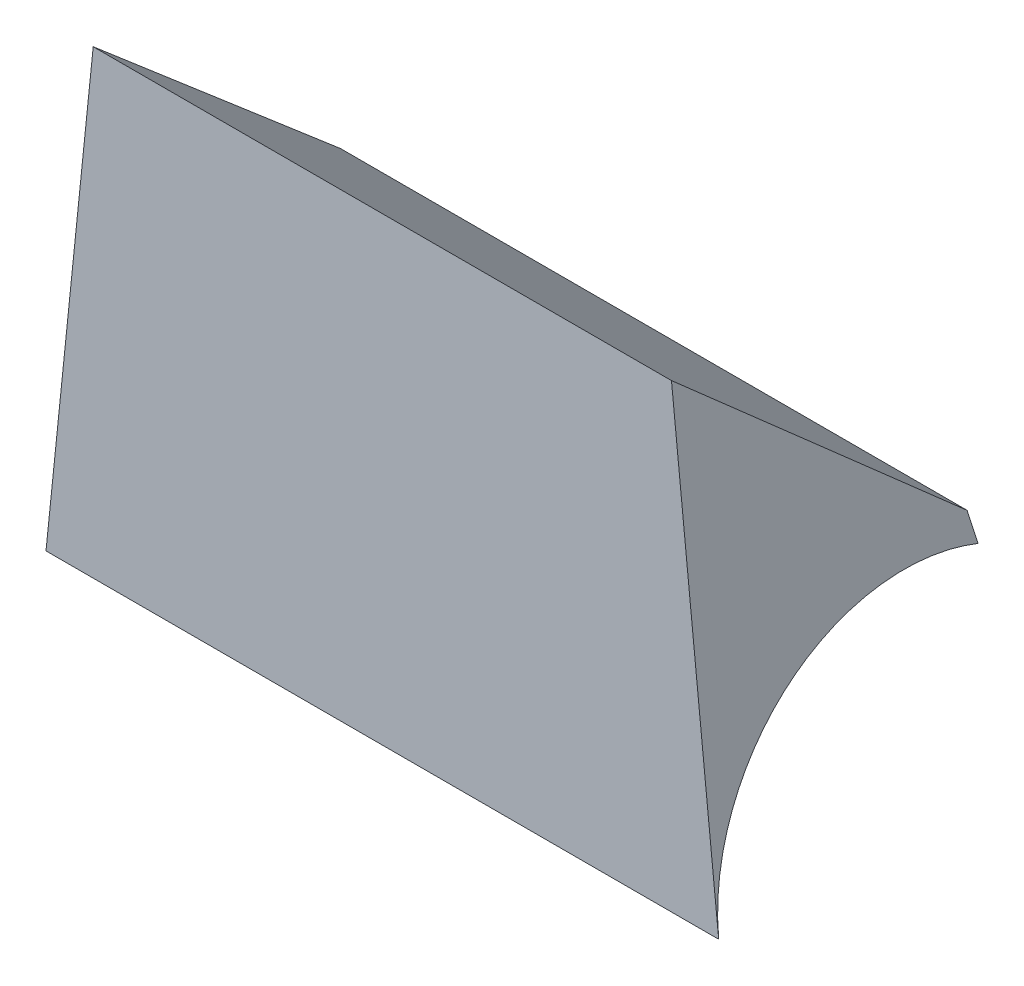
ISO-10303-21;
HEADER;
FILE_DESCRIPTION(('STEP AP214'),'2;1');
FILE_NAME('part.step','',(''),(''),'','','');
FILE_SCHEMA(('AUTOMOTIVE_DESIGN { 1 0 10303 214 1 1 1 1 }'));
ENDSEC;
DATA;
#1=APPLICATION_CONTEXT('core data for automotive mechanical design processes');
#2=APPLICATION_PROTOCOL_DEFINITION('international standard','automotive_design',2000,#1);
#3=PRODUCT_CONTEXT('',#1,'mechanical');
#4=PRODUCT('Part','Part','',(#3));
#5=PRODUCT_RELATED_PRODUCT_CATEGORY('part','',(#4));
#6=PRODUCT_DEFINITION_FORMATION('','',#4);
#7=PRODUCT_DEFINITION_CONTEXT('part definition',#1,'design');
#8=PRODUCT_DEFINITION('design','',#6,#7);
#9=PRODUCT_DEFINITION_SHAPE('','',#8);
#10=(LENGTH_UNIT() NAMED_UNIT(*) SI_UNIT(.MILLI.,.METRE.));
#11=(NAMED_UNIT(*) PLANE_ANGLE_UNIT() SI_UNIT($,.RADIAN.));
#12=(NAMED_UNIT(*) SI_UNIT($,.STERADIAN.) SOLID_ANGLE_UNIT());
#13=UNCERTAINTY_MEASURE_WITH_UNIT(LENGTH_MEASURE(1.E-05),#10,'distance_accuracy_value','');
#14=(GEOMETRIC_REPRESENTATION_CONTEXT(3) GLOBAL_UNCERTAINTY_ASSIGNED_CONTEXT((#13)) GLOBAL_UNIT_ASSIGNED_CONTEXT((#10,
#11,#12)) REPRESENTATION_CONTEXT('',''));
#15=CARTESIAN_POINT('',(0.,0.,0.));
#16=DIRECTION('',(0.,0.,1.));
#17=DIRECTION('',(1.,0.,0.));
#18=AXIS2_PLACEMENT_3D('',#15,#16,#17);
#19=CARTESIAN_POINT('',(57.,0.,0.));
#20=DIRECTION('',(0.,0.,-1.));
#21=DIRECTION('',(0.,1.,0.));
#22=AXIS2_PLACEMENT_3D('',#19,#20,#21);
#23=PLANE('',#22);
#24=DIRECTION('',(-1.,0.,0.));
#25=VECTOR('',#24,1.);
#26=CARTESIAN_POINT('',(57.,0.,0.));
#27=LINE('',#26,#25);
#28=CARTESIAN_POINT('',(53.,0.,0.));
#29=VERTEX_POINT('',#28);
#30=CARTESIAN_POINT('',(4.00000000000001,0.,0.));
#31=VERTEX_POINT('',#30);
#32=EDGE_CURVE('E86',#29,#31,#27,.T.);
#33=ORIENTED_EDGE('',*,*,#32,.T.);
#34=DIRECTION('',(0.102028865498569,0.994781438611052,0.));
#35=VECTOR('',#34,1.);
#36=CARTESIAN_POINT('',(0.,-39.,0.));
#37=LINE('',#36,#35);
#38=CARTESIAN_POINT('',(0.,-39.,0.));
#39=VERTEX_POINT('',#38);
#40=EDGE_CURVE('E48',#39,#31,#37,.T.);
#41=ORIENTED_EDGE('',*,*,#40,.F.);
#42=DIRECTION('',(-1.,0.,0.));
#43=VECTOR('',#42,1.);
#44=CARTESIAN_POINT('',(57.,-39.,0.));
#45=LINE('',#44,#43);
#46=CARTESIAN_POINT('',(57.,-39.,0.));
#47=VERTEX_POINT('',#46);
#48=EDGE_CURVE('E11',#47,#39,#45,.T.);
#49=ORIENTED_EDGE('',*,*,#48,.F.);
#50=DIRECTION('',(0.102028865498569,-0.994781438611052,0.));
#51=VECTOR('',#50,1.);
#52=CARTESIAN_POINT('',(53.,0.,0.));
#53=LINE('',#52,#51);
#54=EDGE_CURVE('E79',#29,#47,#53,.T.);
#55=ORIENTED_EDGE('',*,*,#54,.F.);
#56=EDGE_LOOP('',(#33,#41,#49,#55));
#57=FACE_BOUND('',#56,.T.);
#58=ADVANCED_FACE('F34',(#57),#23,.F.);
#59=CARTESIAN_POINT('',(57.,-39.,-17.5));
#60=DIRECTION('',(-1.,0.,0.));
#61=DIRECTION('',(0.,0.,1.));
#62=AXIS2_PLACEMENT_3D('',#59,#60,#61);
#63=CYLINDRICAL_SURFACE('',#62,17.5);
#64=CARTESIAN_POINT('',(0.,-39.,-17.5));
#65=DIRECTION('',(0.994781438611052,-0.102028865498569,0.));
#66=DIRECTION('',(-0.102028865498569,-0.994781438611053,0.));
#67=AXIS2_PLACEMENT_3D('',#64,#65,#66);
#68=ELLIPSE('',#67,17.5918039086396,17.5);
#69=CARTESIAN_POINT('',(1.68021964803312,-22.6178584316771,-23.6543023678908));
#70=VERTEX_POINT('',#69);
#71=EDGE_CURVE('E72',#70,#39,#68,.T.);
#72=ORIENTED_EDGE('',*,*,#71,.F.);
#73=DIRECTION('',(-1.,0.,0.));
#74=VECTOR('',#73,1.);
#75=CARTESIAN_POINT('',(57.,-22.6178584316771,-23.6543023678908));
#76=LINE('',#75,#74);
#77=CARTESIAN_POINT('',(55.3197803519669,-22.6178584316771,-23.6543023678908));
#78=VERTEX_POINT('',#77);
#79=EDGE_CURVE('E41',#78,#70,#76,.T.);
#80=ORIENTED_EDGE('',*,*,#79,.F.);
#81=CARTESIAN_POINT('',(57.,-39.,-17.5));
#82=DIRECTION('',(-0.994781438611052,-0.102028865498569,0.));
#83=DIRECTION('',(-0.102028865498569,0.994781438611053,0.));
#84=AXIS2_PLACEMENT_3D('',#81,#82,#83);
#85=ELLIPSE('',#84,17.5918039086396,17.5);
#86=EDGE_CURVE('E91',#47,#78,#85,.T.);
#87=ORIENTED_EDGE('',*,*,#86,.F.);
#88=ORIENTED_EDGE('',*,*,#48,.T.);
#89=EDGE_LOOP('',(#72,#80,#87,#88));
#90=FACE_BOUND('',#89,.T.);
#91=ADVANCED_FACE('F90',(#90),#63,.F.);
#92=CARTESIAN_POINT('',(57.,-19.9935949697733,-23.));
#93=DIRECTION('',(0.,0.241921895599665,-0.970295726275997));
#94=DIRECTION('',(0.,0.970295726275997,0.241921895599665));
#95=AXIS2_PLACEMENT_3D('',#92,#93,#94);
#96=PLANE('',#95);
#97=DIRECTION('',(-0.0990283433199499,-0.965526347369512,-0.240732755882109));
#98=VECTOR('',#97,1.);
#99=CARTESIAN_POINT('',(2.48923503883209,-14.7299583713871,-21.6876279992321));
#100=LINE('',#99,#98);
#101=CARTESIAN_POINT('',(1.94937487489505,-19.9935949697733,-23.));
#102=VERTEX_POINT('',#101);
#103=EDGE_CURVE('E75',#102,#70,#100,.T.);
#104=ORIENTED_EDGE('',*,*,#103,.F.);
#105=DIRECTION('',(-1.,0.,0.));
#106=VECTOR('',#105,1.);
#107=CARTESIAN_POINT('',(57.,-19.9935949697733,-23.));
#108=LINE('',#107,#106);
#109=CARTESIAN_POINT('',(55.050625125105,-19.9935949697733,-23.));
#110=VERTEX_POINT('',#109);
#111=EDGE_CURVE('E93',#110,#102,#108,.T.);
#112=ORIENTED_EDGE('',*,*,#111,.F.);
#113=DIRECTION('',(-0.0990283433199498,0.965526347369512,0.240732755882109));
#114=VECTOR('',#113,1.);
#115=CARTESIAN_POINT('',(55.0697418896675,-20.1799834242577,-23.0464718611096));
#116=LINE('',#115,#114);
#117=EDGE_CURVE('E56',#78,#110,#116,.T.);
#118=ORIENTED_EDGE('',*,*,#117,.F.);
#119=ORIENTED_EDGE('',*,*,#79,.T.);
#120=EDGE_LOOP('',(#104,#112,#118,#119));
#121=FACE_BOUND('',#120,.T.);
#122=ADVANCED_FACE('F101',(#121),#96,.T.);
#123=CARTESIAN_POINT('',(57.,0.,0.));
#124=DIRECTION('',(0.,0.754709580222771,-0.656059028990508));
#125=DIRECTION('',(0.,0.656059028990508,0.754709580222771));
#126=AXIS2_PLACEMENT_3D('',#123,#124,#125);
#127=PLANE('',#126);
#128=DIRECTION('',(-0.0671362910574192,-0.654578837809837,-0.75300681505188));
#129=VECTOR('',#128,1.);
#130=CARTESIAN_POINT('',(4.23888592357817,2.32913775488711,2.67936648928779));
#131=LINE('',#130,#129);
#132=EDGE_CURVE('E87',#31,#102,#131,.T.);
#133=ORIENTED_EDGE('',*,*,#132,.F.);
#134=ORIENTED_EDGE('',*,*,#32,.F.);
#135=DIRECTION('',(-0.0671362910574192,0.654578837809837,0.75300681505188));
#136=VECTOR('',#135,1.);
#137=CARTESIAN_POINT('',(53.0180291263078,-0.175783981500914,-0.202216338814173));
#138=LINE('',#137,#136);
#139=EDGE_CURVE('E95',#110,#29,#138,.T.);
#140=ORIENTED_EDGE('',*,*,#139,.F.);
#141=ORIENTED_EDGE('',*,*,#111,.T.);
#142=EDGE_LOOP('',(#133,#134,#140,#141));
#143=FACE_BOUND('',#142,.T.);
#144=ADVANCED_FACE('F104',(#143),#127,.T.);
#145=CARTESIAN_POINT('',(53.,0.,-23.6543023678908));
#146=DIRECTION('',(-0.994781438611052,-0.102028865498569,0.));
#147=DIRECTION('',(0.102028865498569,-0.994781438611053,0.));
#148=AXIS2_PLACEMENT_3D('',#145,#146,#147);
#149=PLANE('',#148);
#150=ORIENTED_EDGE('',*,*,#86,.T.);
#151=ORIENTED_EDGE('',*,*,#117,.T.);
#152=ORIENTED_EDGE('',*,*,#139,.T.);
#153=ORIENTED_EDGE('',*,*,#54,.T.);
#154=EDGE_LOOP('',(#150,#151,#152,#153));
#155=FACE_BOUND('',#154,.T.);
#156=ADVANCED_FACE('F108',(#155),#149,.F.);
#157=CARTESIAN_POINT('',(0.,-39.,-23.6543023678908));
#158=DIRECTION('',(0.994781438611052,-0.102028865498569,0.));
#159=DIRECTION('',(0.102028865498569,0.994781438611053,0.));
#160=AXIS2_PLACEMENT_3D('',#157,#158,#159);
#161=PLANE('',#160);
#162=ORIENTED_EDGE('',*,*,#71,.T.);
#163=ORIENTED_EDGE('',*,*,#40,.T.);
#164=ORIENTED_EDGE('',*,*,#132,.T.);
#165=ORIENTED_EDGE('',*,*,#103,.T.);
#166=EDGE_LOOP('',(#162,#163,#164,#165));
#167=FACE_BOUND('',#166,.T.);
#168=ADVANCED_FACE('F73',(#167),#161,.F.);
#169=CLOSED_SHELL('',(#58,#91,#122,#144,#156,#168));
#170=MANIFOLD_SOLID_BREP('B2',#169);
#171=ADVANCED_BREP_SHAPE_REPRESENTATION('',(#18,#170),#14);
#172=SHAPE_DEFINITION_REPRESENTATION(#9,#171);
ENDSEC;
END-ISO-10303-21;
